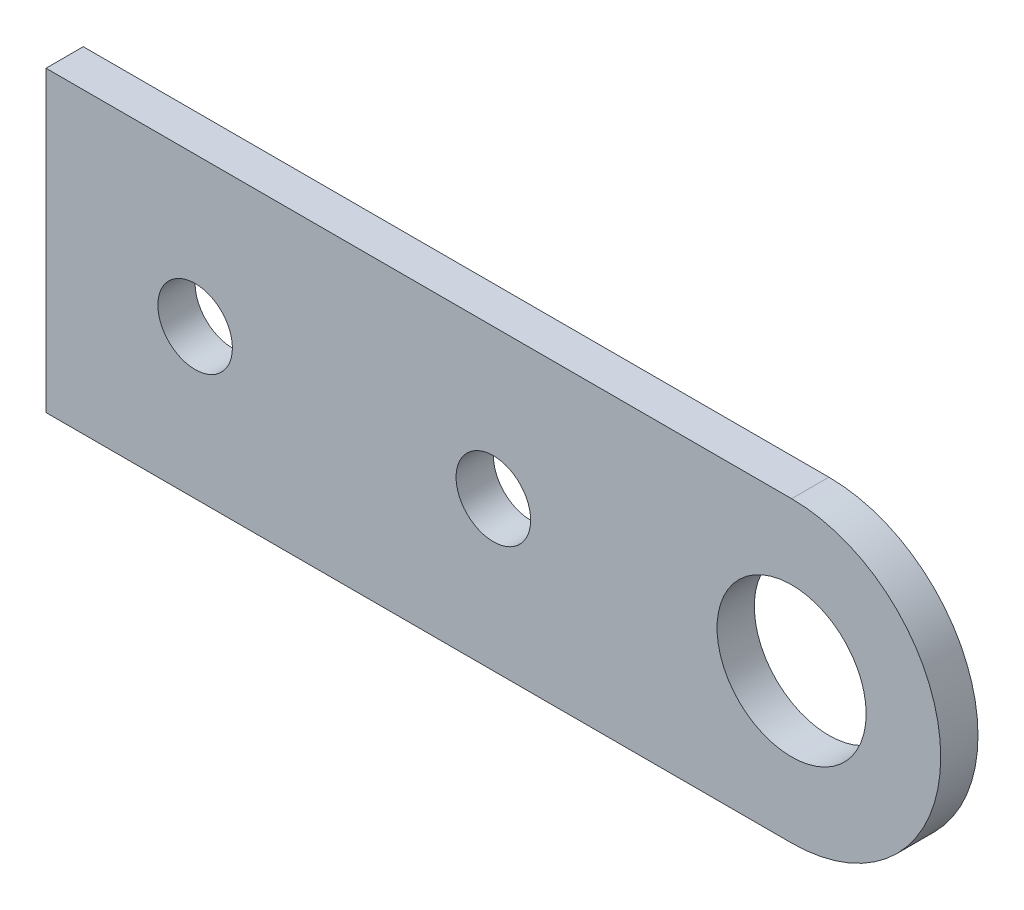
ISO-10303-21;
HEADER;
FILE_DESCRIPTION(('STEP AP214'),'2;1');
FILE_NAME('part.step','',(''),(''),'','','');
FILE_SCHEMA(('AUTOMOTIVE_DESIGN { 1 0 10303 214 1 1 1 1 }'));
ENDSEC;
DATA;
#1=APPLICATION_CONTEXT('core data for automotive mechanical design processes');
#2=APPLICATION_PROTOCOL_DEFINITION('international standard','automotive_design',2000,#1);
#3=PRODUCT_CONTEXT('',#1,'mechanical');
#4=PRODUCT('Part','Part','',(#3));
#5=PRODUCT_RELATED_PRODUCT_CATEGORY('part','',(#4));
#6=PRODUCT_DEFINITION_FORMATION('','',#4);
#7=PRODUCT_DEFINITION_CONTEXT('part definition',#1,'design');
#8=PRODUCT_DEFINITION('design','',#6,#7);
#9=PRODUCT_DEFINITION_SHAPE('','',#8);
#10=(LENGTH_UNIT() NAMED_UNIT(*) SI_UNIT(.MILLI.,.METRE.));
#11=(NAMED_UNIT(*) PLANE_ANGLE_UNIT() SI_UNIT($,.RADIAN.));
#12=(NAMED_UNIT(*) SI_UNIT($,.STERADIAN.) SOLID_ANGLE_UNIT());
#13=UNCERTAINTY_MEASURE_WITH_UNIT(LENGTH_MEASURE(1.E-05),#10,'distance_accuracy_value','');
#14=(GEOMETRIC_REPRESENTATION_CONTEXT(3) GLOBAL_UNCERTAINTY_ASSIGNED_CONTEXT((#13)) GLOBAL_UNIT_ASSIGNED_CONTEXT((#10,
#11,#12)) REPRESENTATION_CONTEXT('',''));
#15=CARTESIAN_POINT('',(0.,0.,0.));
#16=DIRECTION('',(0.,0.,1.));
#17=DIRECTION('',(1.,0.,0.));
#18=AXIS2_PLACEMENT_3D('',#15,#16,#17);
#19=CARTESIAN_POINT('',(0.,0.,-3.175));
#20=DIRECTION('',(0.,0.,1.));
#21=DIRECTION('',(1.,0.,0.));
#22=AXIS2_PLACEMENT_3D('',#19,#20,#21);
#23=CYLINDRICAL_SURFACE('',#22,12.7);
#24=CARTESIAN_POINT('',(0.,0.,0.));
#25=DIRECTION('',(0.,0.,1.));
#26=DIRECTION('',(-1.,0.,0.));
#27=AXIS2_PLACEMENT_3D('',#24,#25,#26);
#28=CIRCLE('',#27,12.7);
#29=CARTESIAN_POINT('',(0.,-12.7,0.));
#30=VERTEX_POINT('',#29);
#31=CARTESIAN_POINT('',(0.,12.7,0.));
#32=VERTEX_POINT('',#31);
#33=EDGE_CURVE('E104',#30,#32,#28,.T.);
#34=ORIENTED_EDGE('',*,*,#33,.F.);
#35=DIRECTION('',(0.,0.,1.));
#36=VECTOR('',#35,1.);
#37=CARTESIAN_POINT('',(0.,-12.7,-3.175));
#38=LINE('',#37,#36);
#39=CARTESIAN_POINT('',(0.,-12.7,-3.175));
#40=VERTEX_POINT('',#39);
#41=EDGE_CURVE('E11',#40,#30,#38,.T.);
#42=ORIENTED_EDGE('',*,*,#41,.F.);
#43=CARTESIAN_POINT('',(0.,0.,-3.175));
#44=DIRECTION('',(0.,0.,1.));
#45=DIRECTION('',(-1.,0.,0.));
#46=AXIS2_PLACEMENT_3D('',#43,#44,#45);
#47=CIRCLE('',#46,12.7);
#48=CARTESIAN_POINT('',(0.,12.7,-3.175));
#49=VERTEX_POINT('',#48);
#50=EDGE_CURVE('E97',#40,#49,#47,.T.);
#51=ORIENTED_EDGE('',*,*,#50,.T.);
#52=DIRECTION('',(0.,0.,1.));
#53=VECTOR('',#52,1.);
#54=CARTESIAN_POINT('',(0.,12.7,-3.175));
#55=LINE('',#54,#53);
#56=EDGE_CURVE('E42',#49,#32,#55,.T.);
#57=ORIENTED_EDGE('',*,*,#56,.T.);
#58=EDGE_LOOP('',(#34,#42,#51,#57));
#59=FACE_BOUND('',#58,.T.);
#60=ADVANCED_FACE('F39',(#59),#23,.T.);
#61=CARTESIAN_POINT('',(0.,-12.7,-3.175));
#62=DIRECTION('',(0.,-1.,0.));
#63=DIRECTION('',(1.,0.,0.));
#64=AXIS2_PLACEMENT_3D('',#61,#62,#63);
#65=PLANE('',#64);
#66=DIRECTION('',(1.,0.,0.));
#67=VECTOR('',#66,1.);
#68=CARTESIAN_POINT('',(0.,-12.7,0.));
#69=LINE('',#68,#67);
#70=CARTESIAN_POINT('',(-63.5,-12.7,0.));
#71=VERTEX_POINT('',#70);
#72=EDGE_CURVE('E99',#71,#30,#69,.T.);
#73=ORIENTED_EDGE('',*,*,#72,.F.);
#74=DIRECTION('',(0.,0.,1.));
#75=VECTOR('',#74,1.);
#76=CARTESIAN_POINT('',(-63.5,-12.7,-3.175));
#77=LINE('',#76,#75);
#78=CARTESIAN_POINT('',(-63.5,-12.7,-3.175));
#79=VERTEX_POINT('',#78);
#80=EDGE_CURVE('E48',#79,#71,#77,.T.);
#81=ORIENTED_EDGE('',*,*,#80,.F.);
#82=DIRECTION('',(1.,0.,0.));
#83=VECTOR('',#82,1.);
#84=CARTESIAN_POINT('',(0.,-12.7,-3.175));
#85=LINE('',#84,#83);
#86=EDGE_CURVE('E94',#79,#40,#85,.T.);
#87=ORIENTED_EDGE('',*,*,#86,.T.);
#88=ORIENTED_EDGE('',*,*,#41,.T.);
#89=EDGE_LOOP('',(#73,#81,#87,#88));
#90=FACE_BOUND('',#89,.T.);
#91=ADVANCED_FACE('F115',(#90),#65,.T.);
#92=CARTESIAN_POINT('',(-63.5,12.7,-3.175));
#93=DIRECTION('',(-1.,0.,0.));
#94=DIRECTION('',(0.,0.,1.));
#95=AXIS2_PLACEMENT_3D('',#92,#93,#94);
#96=PLANE('',#95);
#97=DIRECTION('',(0.,-1.,0.));
#98=VECTOR('',#97,1.);
#99=CARTESIAN_POINT('',(-63.5,12.7,0.));
#100=LINE('',#99,#98);
#101=CARTESIAN_POINT('',(-63.5,12.7,0.));
#102=VERTEX_POINT('',#101);
#103=EDGE_CURVE('E89',#102,#71,#100,.T.);
#104=ORIENTED_EDGE('',*,*,#103,.F.);
#105=DIRECTION('',(0.,0.,1.));
#106=VECTOR('',#105,1.);
#107=CARTESIAN_POINT('',(-63.5,12.7,-3.175));
#108=LINE('',#107,#106);
#109=CARTESIAN_POINT('',(-63.5,12.7,-3.175));
#110=VERTEX_POINT('',#109);
#111=EDGE_CURVE('E84',#110,#102,#108,.T.);
#112=ORIENTED_EDGE('',*,*,#111,.F.);
#113=DIRECTION('',(0.,-1.,0.));
#114=VECTOR('',#113,1.);
#115=CARTESIAN_POINT('',(-63.5,12.7,-3.175));
#116=LINE('',#115,#114);
#117=EDGE_CURVE('E87',#110,#79,#116,.T.);
#118=ORIENTED_EDGE('',*,*,#117,.T.);
#119=ORIENTED_EDGE('',*,*,#80,.T.);
#120=EDGE_LOOP('',(#104,#112,#118,#119));
#121=FACE_BOUND('',#120,.T.);
#122=ADVANCED_FACE('F86',(#121),#96,.T.);
#123=CARTESIAN_POINT('',(0.,12.7,-3.175));
#124=DIRECTION('',(0.,1.,0.));
#125=DIRECTION('',(-1.,0.,0.));
#126=AXIS2_PLACEMENT_3D('',#123,#124,#125);
#127=PLANE('',#126);
#128=DIRECTION('',(-1.,0.,0.));
#129=VECTOR('',#128,1.);
#130=CARTESIAN_POINT('',(0.,12.7,0.));
#131=LINE('',#130,#129);
#132=EDGE_CURVE('E107',#32,#102,#131,.T.);
#133=ORIENTED_EDGE('',*,*,#132,.F.);
#134=ORIENTED_EDGE('',*,*,#56,.F.);
#135=DIRECTION('',(-1.,0.,0.));
#136=VECTOR('',#135,1.);
#137=CARTESIAN_POINT('',(0.,12.7,-3.175));
#138=LINE('',#137,#136);
#139=EDGE_CURVE('E93',#49,#110,#138,.T.);
#140=ORIENTED_EDGE('',*,*,#139,.T.);
#141=ORIENTED_EDGE('',*,*,#111,.T.);
#142=EDGE_LOOP('',(#133,#134,#140,#141));
#143=FACE_BOUND('',#142,.T.);
#144=ADVANCED_FACE('F96',(#143),#127,.T.);
#145=CARTESIAN_POINT('',(0.,0.,-3.175));
#146=DIRECTION('',(0.,0.,-1.));
#147=DIRECTION('',(-1.,0.,0.));
#148=AXIS2_PLACEMENT_3D('',#145,#146,#147);
#149=PLANE('',#148);
#150=CARTESIAN_POINT('',(-25.4,0.,-3.175));
#151=DIRECTION('',(0.,0.,1.));
#152=DIRECTION('',(1.,0.,0.));
#153=AXIS2_PLACEMENT_3D('',#150,#151,#152);
#154=CIRCLE('',#153,3.175);
#155=CARTESIAN_POINT('',(-22.225,0.,-3.175));
#156=VERTEX_POINT('',#155);
#157=EDGE_CURVE('E152',#156,#156,#154,.T.);
#158=ORIENTED_EDGE('',*,*,#157,.T.);
#159=EDGE_LOOP('',(#158));
#160=FACE_BOUND('',#159,.T.);
#161=CARTESIAN_POINT('',(-50.8,0.,-3.175));
#162=DIRECTION('',(0.,0.,1.));
#163=DIRECTION('',(1.,0.,0.));
#164=AXIS2_PLACEMENT_3D('',#161,#162,#163);
#165=CIRCLE('',#164,3.175);
#166=CARTESIAN_POINT('',(-47.625,0.,-3.175));
#167=VERTEX_POINT('',#166);
#168=EDGE_CURVE('E160',#167,#167,#165,.T.);
#169=ORIENTED_EDGE('',*,*,#168,.T.);
#170=EDGE_LOOP('',(#169));
#171=FACE_BOUND('',#170,.T.);
#172=CARTESIAN_POINT('',(0.,0.,-3.175));
#173=DIRECTION('',(0.,0.,1.));
#174=DIRECTION('',(1.,0.,0.));
#175=AXIS2_PLACEMENT_3D('',#172,#173,#174);
#176=CIRCLE('',#175,6.35);
#177=CARTESIAN_POINT('',(6.35,0.,-3.175));
#178=VERTEX_POINT('',#177);
#179=EDGE_CURVE('E108',#178,#178,#176,.T.);
#180=ORIENTED_EDGE('',*,*,#179,.T.);
#181=EDGE_LOOP('',(#180));
#182=FACE_BOUND('',#181,.T.);
#183=ORIENTED_EDGE('',*,*,#50,.F.);
#184=ORIENTED_EDGE('',*,*,#86,.F.);
#185=ORIENTED_EDGE('',*,*,#117,.F.);
#186=ORIENTED_EDGE('',*,*,#139,.F.);
#187=EDGE_LOOP('',(#183,#184,#185,#186));
#188=FACE_BOUND('',#187,.T.);
#189=ADVANCED_FACE('F92',(#160,#171,#182,#188),#149,.T.);
#190=CARTESIAN_POINT('',(0.,0.,0.));
#191=DIRECTION('',(0.,0.,-1.));
#192=DIRECTION('',(-1.,0.,0.));
#193=AXIS2_PLACEMENT_3D('',#190,#191,#192);
#194=PLANE('',#193);
#195=CARTESIAN_POINT('',(-25.4,0.,0.));
#196=DIRECTION('',(0.,0.,1.));
#197=DIRECTION('',(1.,0.,0.));
#198=AXIS2_PLACEMENT_3D('',#195,#196,#197);
#199=CIRCLE('',#198,3.175);
#200=CARTESIAN_POINT('',(-22.225,0.,0.));
#201=VERTEX_POINT('',#200);
#202=EDGE_CURVE('E155',#201,#201,#199,.T.);
#203=ORIENTED_EDGE('',*,*,#202,.F.);
#204=EDGE_LOOP('',(#203));
#205=FACE_BOUND('',#204,.T.);
#206=CARTESIAN_POINT('',(-50.8,0.,0.));
#207=DIRECTION('',(0.,0.,1.));
#208=DIRECTION('',(1.,0.,0.));
#209=AXIS2_PLACEMENT_3D('',#206,#207,#208);
#210=CIRCLE('',#209,3.175);
#211=CARTESIAN_POINT('',(-47.625,0.,0.));
#212=VERTEX_POINT('',#211);
#213=EDGE_CURVE('E157',#212,#212,#210,.T.);
#214=ORIENTED_EDGE('',*,*,#213,.F.);
#215=EDGE_LOOP('',(#214));
#216=FACE_BOUND('',#215,.T.);
#217=CARTESIAN_POINT('',(0.,0.,0.));
#218=DIRECTION('',(0.,0.,1.));
#219=DIRECTION('',(1.,0.,0.));
#220=AXIS2_PLACEMENT_3D('',#217,#218,#219);
#221=CIRCLE('',#220,6.35);
#222=CARTESIAN_POINT('',(6.35,0.,0.));
#223=VERTEX_POINT('',#222);
#224=EDGE_CURVE('E163',#223,#223,#221,.T.);
#225=ORIENTED_EDGE('',*,*,#224,.F.);
#226=EDGE_LOOP('',(#225));
#227=FACE_BOUND('',#226,.T.);
#228=ORIENTED_EDGE('',*,*,#33,.T.);
#229=ORIENTED_EDGE('',*,*,#132,.T.);
#230=ORIENTED_EDGE('',*,*,#103,.T.);
#231=ORIENTED_EDGE('',*,*,#72,.T.);
#232=EDGE_LOOP('',(#228,#229,#230,#231));
#233=FACE_BOUND('',#232,.T.);
#234=ADVANCED_FACE('F114',(#205,#216,#227,#233),#194,.F.);
#235=CARTESIAN_POINT('',(0.,0.,-3.175));
#236=DIRECTION('',(0.,0.,1.));
#237=DIRECTION('',(1.,0.,0.));
#238=AXIS2_PLACEMENT_3D('',#235,#236,#237);
#239=CYLINDRICAL_SURFACE('',#238,6.35);
#240=ORIENTED_EDGE('',*,*,#179,.F.);
#241=EDGE_LOOP('',(#240));
#242=FACE_BOUND('',#241,.T.);
#243=ORIENTED_EDGE('',*,*,#224,.T.);
#244=EDGE_LOOP('',(#243));
#245=FACE_BOUND('',#244,.T.);
#246=ADVANCED_FACE('F133',(#242,#245),#239,.F.);
#247=CARTESIAN_POINT('',(-50.8,0.,-3.175));
#248=DIRECTION('',(0.,0.,1.));
#249=DIRECTION('',(1.,0.,0.));
#250=AXIS2_PLACEMENT_3D('',#247,#248,#249);
#251=CYLINDRICAL_SURFACE('',#250,3.175);
#252=ORIENTED_EDGE('',*,*,#168,.F.);
#253=EDGE_LOOP('',(#252));
#254=FACE_BOUND('',#253,.T.);
#255=ORIENTED_EDGE('',*,*,#213,.T.);
#256=EDGE_LOOP('',(#255));
#257=FACE_BOUND('',#256,.T.);
#258=ADVANCED_FACE('F140',(#254,#257),#251,.F.);
#259=CARTESIAN_POINT('',(-25.4,0.,-3.175));
#260=DIRECTION('',(0.,0.,1.));
#261=DIRECTION('',(1.,0.,0.));
#262=AXIS2_PLACEMENT_3D('',#259,#260,#261);
#263=CYLINDRICAL_SURFACE('',#262,3.175);
#264=ORIENTED_EDGE('',*,*,#157,.F.);
#265=EDGE_LOOP('',(#264));
#266=FACE_BOUND('',#265,.T.);
#267=ORIENTED_EDGE('',*,*,#202,.T.);
#268=EDGE_LOOP('',(#267));
#269=FACE_BOUND('',#268,.T.);
#270=ADVANCED_FACE('F144',(#266,#269),#263,.F.);
#271=CLOSED_SHELL('',(#60,#91,#122,#144,#189,#234,#246,#258,#270));
#272=MANIFOLD_SOLID_BREP('B2',#271);
#273=ADVANCED_BREP_SHAPE_REPRESENTATION('',(#18,#272),#14);
#274=SHAPE_DEFINITION_REPRESENTATION(#9,#273);
ENDSEC;
END-ISO-10303-21;
